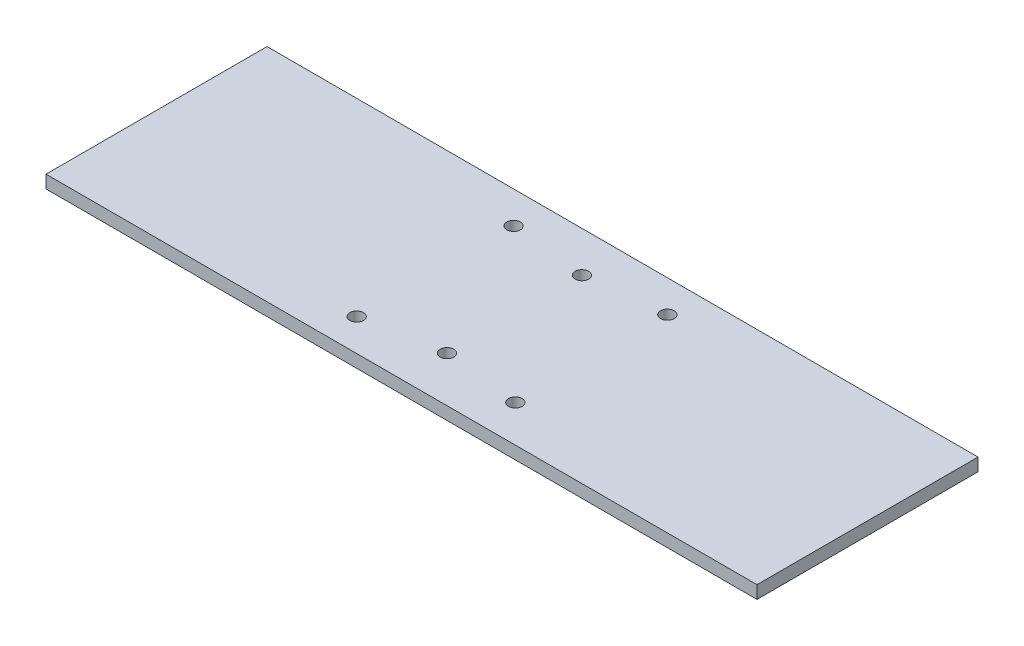
ISO-10303-21;
HEADER;
FILE_DESCRIPTION(('STEP AP214'),'2;1');
FILE_NAME('part.step','',(''),(''),'','','');
FILE_SCHEMA(('AUTOMOTIVE_DESIGN { 1 0 10303 214 1 1 1 1 }'));
ENDSEC;
DATA;
#1=APPLICATION_CONTEXT('core data for automotive mechanical design processes');
#2=APPLICATION_PROTOCOL_DEFINITION('international standard','automotive_design',2000,#1);
#3=PRODUCT_CONTEXT('',#1,'mechanical');
#4=PRODUCT('Part','Part','',(#3));
#5=PRODUCT_RELATED_PRODUCT_CATEGORY('part','',(#4));
#6=PRODUCT_DEFINITION_FORMATION('','',#4);
#7=PRODUCT_DEFINITION_CONTEXT('part definition',#1,'design');
#8=PRODUCT_DEFINITION('design','',#6,#7);
#9=PRODUCT_DEFINITION_SHAPE('','',#8);
#10=(LENGTH_UNIT() NAMED_UNIT(*) SI_UNIT(.MILLI.,.METRE.));
#11=(NAMED_UNIT(*) PLANE_ANGLE_UNIT() SI_UNIT($,.RADIAN.));
#12=(NAMED_UNIT(*) SI_UNIT($,.STERADIAN.) SOLID_ANGLE_UNIT());
#13=UNCERTAINTY_MEASURE_WITH_UNIT(LENGTH_MEASURE(1.E-05),#10,'distance_accuracy_value','');
#14=(GEOMETRIC_REPRESENTATION_CONTEXT(3) GLOBAL_UNCERTAINTY_ASSIGNED_CONTEXT((#13)) GLOBAL_UNIT_ASSIGNED_CONTEXT((#10,
#11,#12)) REPRESENTATION_CONTEXT('',''));
#15=CARTESIAN_POINT('',(0.,0.,0.));
#16=DIRECTION('',(0.,0.,1.));
#17=DIRECTION('',(1.,0.,0.));
#18=AXIS2_PLACEMENT_3D('',#15,#16,#17);
#19=CARTESIAN_POINT('',(-83.24,3.,-51.75));
#20=DIRECTION('',(1.,0.,0.));
#21=DIRECTION('',(0.,0.,-1.));
#22=AXIS2_PLACEMENT_3D('',#19,#20,#21);
#23=PLANE('',#22);
#24=DIRECTION('',(0.,0.,1.));
#25=VECTOR('',#24,1.);
#26=CARTESIAN_POINT('',(-83.24,0.,-51.75));
#27=LINE('',#26,#25);
#28=CARTESIAN_POINT('',(-83.24,0.,-51.75));
#29=VERTEX_POINT('',#28);
#30=CARTESIAN_POINT('',(-83.24,0.,0.));
#31=VERTEX_POINT('',#30);
#32=EDGE_CURVE('E105',#29,#31,#27,.T.);
#33=ORIENTED_EDGE('',*,*,#32,.T.);
#34=DIRECTION('',(0.,-1.,0.));
#35=VECTOR('',#34,1.);
#36=CARTESIAN_POINT('',(-83.24,3.,0.));
#37=LINE('',#36,#35);
#38=CARTESIAN_POINT('',(-83.24,3.,0.));
#39=VERTEX_POINT('',#38);
#40=EDGE_CURVE('E11',#39,#31,#37,.T.);
#41=ORIENTED_EDGE('',*,*,#40,.F.);
#42=DIRECTION('',(0.,0.,1.));
#43=VECTOR('',#42,1.);
#44=CARTESIAN_POINT('',(-83.24,3.,-51.75));
#45=LINE('',#44,#43);
#46=CARTESIAN_POINT('',(-83.24,3.,-51.75));
#47=VERTEX_POINT('',#46);
#48=EDGE_CURVE('E92',#47,#39,#45,.T.);
#49=ORIENTED_EDGE('',*,*,#48,.F.);
#50=DIRECTION('',(0.,-1.,0.));
#51=VECTOR('',#50,1.);
#52=CARTESIAN_POINT('',(-83.24,3.,-51.75));
#53=LINE('',#52,#51);
#54=EDGE_CURVE('E101',#47,#29,#53,.T.);
#55=ORIENTED_EDGE('',*,*,#54,.T.);
#56=EDGE_LOOP('',(#33,#41,#49,#55));
#57=FACE_BOUND('',#56,.T.);
#58=ADVANCED_FACE('F39',(#57),#23,.F.);
#59=CARTESIAN_POINT('',(-83.24,3.,0.));
#60=DIRECTION('',(0.,0.,-1.));
#61=DIRECTION('',(-1.,0.,0.));
#62=AXIS2_PLACEMENT_3D('',#59,#60,#61);
#63=PLANE('',#62);
#64=DIRECTION('',(1.,0.,0.));
#65=VECTOR('',#64,1.);
#66=CARTESIAN_POINT('',(-83.24,0.,0.));
#67=LINE('',#66,#65);
#68=CARTESIAN_POINT('',(83.24,0.,0.));
#69=VERTEX_POINT('',#68);
#70=EDGE_CURVE('E96',#31,#69,#67,.T.);
#71=ORIENTED_EDGE('',*,*,#70,.T.);
#72=DIRECTION('',(0.,-1.,0.));
#73=VECTOR('',#72,1.);
#74=CARTESIAN_POINT('',(83.24,3.,0.));
#75=LINE('',#74,#73);
#76=CARTESIAN_POINT('',(83.24,3.,0.));
#77=VERTEX_POINT('',#76);
#78=EDGE_CURVE('E48',#77,#69,#75,.T.);
#79=ORIENTED_EDGE('',*,*,#78,.F.);
#80=DIRECTION('',(1.,0.,0.));
#81=VECTOR('',#80,1.);
#82=CARTESIAN_POINT('',(-83.24,3.,0.));
#83=LINE('',#82,#81);
#84=EDGE_CURVE('E87',#39,#77,#83,.T.);
#85=ORIENTED_EDGE('',*,*,#84,.F.);
#86=ORIENTED_EDGE('',*,*,#40,.T.);
#87=EDGE_LOOP('',(#71,#79,#85,#86));
#88=FACE_BOUND('',#87,.T.);
#89=ADVANCED_FACE('F95',(#88),#63,.F.);
#90=CARTESIAN_POINT('',(83.24,3.,-51.75));
#91=DIRECTION('',(-1.,0.,0.));
#92=DIRECTION('',(0.,0.,1.));
#93=AXIS2_PLACEMENT_3D('',#90,#91,#92);
#94=PLANE('',#93);
#95=DIRECTION('',(0.,0.,-1.));
#96=VECTOR('',#95,1.);
#97=CARTESIAN_POINT('',(83.24,0.,-51.75));
#98=LINE('',#97,#96);
#99=CARTESIAN_POINT('',(83.24,0.,-51.75));
#100=VERTEX_POINT('',#99);
#101=EDGE_CURVE('E74',#69,#100,#98,.T.);
#102=ORIENTED_EDGE('',*,*,#101,.T.);
#103=DIRECTION('',(0.,-1.,0.));
#104=VECTOR('',#103,1.);
#105=CARTESIAN_POINT('',(83.24,3.,-51.75));
#106=LINE('',#105,#104);
#107=CARTESIAN_POINT('',(83.24,3.,-51.75));
#108=VERTEX_POINT('',#107);
#109=EDGE_CURVE('E97',#108,#100,#106,.T.);
#110=ORIENTED_EDGE('',*,*,#109,.F.);
#111=DIRECTION('',(0.,0.,-1.));
#112=VECTOR('',#111,1.);
#113=CARTESIAN_POINT('',(83.24,3.,-51.75));
#114=LINE('',#113,#112);
#115=EDGE_CURVE('E90',#77,#108,#114,.T.);
#116=ORIENTED_EDGE('',*,*,#115,.F.);
#117=ORIENTED_EDGE('',*,*,#78,.T.);
#118=EDGE_LOOP('',(#102,#110,#116,#117));
#119=FACE_BOUND('',#118,.T.);
#120=ADVANCED_FACE('F99',(#119),#94,.F.);
#121=CARTESIAN_POINT('',(-83.24,3.,-51.75));
#122=DIRECTION('',(0.,0.,1.));
#123=DIRECTION('',(1.,0.,0.));
#124=AXIS2_PLACEMENT_3D('',#121,#122,#123);
#125=PLANE('',#124);
#126=DIRECTION('',(-1.,0.,0.));
#127=VECTOR('',#126,1.);
#128=CARTESIAN_POINT('',(-83.24,0.,-51.75));
#129=LINE('',#128,#127);
#130=EDGE_CURVE('E80',#100,#29,#129,.T.);
#131=ORIENTED_EDGE('',*,*,#130,.T.);
#132=ORIENTED_EDGE('',*,*,#54,.F.);
#133=DIRECTION('',(-1.,0.,0.));
#134=VECTOR('',#133,1.);
#135=CARTESIAN_POINT('',(-83.24,3.,-51.75));
#136=LINE('',#135,#134);
#137=EDGE_CURVE('E57',#108,#47,#136,.T.);
#138=ORIENTED_EDGE('',*,*,#137,.F.);
#139=ORIENTED_EDGE('',*,*,#109,.T.);
#140=EDGE_LOOP('',(#131,#132,#138,#139));
#141=FACE_BOUND('',#140,.T.);
#142=ADVANCED_FACE('F151',(#141),#125,.F.);
#143=CARTESIAN_POINT('',(0.,3.,0.));
#144=DIRECTION('',(0.,1.,0.));
#145=DIRECTION('',(0.,0.,1.));
#146=AXIS2_PLACEMENT_3D('',#143,#144,#145);
#147=PLANE('',#146);
#148=CARTESIAN_POINT('',(-18.,3.,-7.5));
#149=DIRECTION('',(0.,1.,0.));
#150=DIRECTION('',(0.,0.,1.));
#151=AXIS2_PLACEMENT_3D('',#148,#149,#150);
#152=CIRCLE('',#151,1.6);
#153=CARTESIAN_POINT('',(-18.,3.,-5.9));
#154=VERTEX_POINT('',#153);
#155=EDGE_CURVE('E286',#154,#154,#152,.T.);
#156=ORIENTED_EDGE('',*,*,#155,.F.);
#157=EDGE_LOOP('',(#156));
#158=FACE_BOUND('',#157,.T.);
#159=CARTESIAN_POINT('',(18.,3.,-8.65378948989618));
#160=DIRECTION('',(0.,1.,0.));
#161=DIRECTION('',(0.,0.,1.));
#162=AXIS2_PLACEMENT_3D('',#159,#160,#161);
#163=CIRCLE('',#162,1.6);
#164=CARTESIAN_POINT('',(18.,3.,-7.05378948989618));
#165=VERTEX_POINT('',#164);
#166=EDGE_CURVE('E287',#165,#165,#163,.T.);
#167=ORIENTED_EDGE('',*,*,#166,.F.);
#168=EDGE_LOOP('',(#167));
#169=FACE_BOUND('',#168,.T.);
#170=CARTESIAN_POINT('',(0.,3.,-10.6537894898962));
#171=DIRECTION('',(0.,1.,0.));
#172=DIRECTION('',(0.,0.,1.));
#173=AXIS2_PLACEMENT_3D('',#170,#171,#172);
#174=CIRCLE('',#173,1.6);
#175=CARTESIAN_POINT('',(0.,3.,-9.05378948989618));
#176=VERTEX_POINT('',#175);
#177=EDGE_CURVE('E126',#176,#176,#174,.T.);
#178=ORIENTED_EDGE('',*,*,#177,.F.);
#179=EDGE_LOOP('',(#178));
#180=FACE_BOUND('',#179,.T.);
#181=CARTESIAN_POINT('',(-18.,3.,-44.25));
#182=DIRECTION('',(0.,1.,0.));
#183=DIRECTION('',(0.,0.,1.));
#184=AXIS2_PLACEMENT_3D('',#181,#182,#183);
#185=CIRCLE('',#184,1.6);
#186=CARTESIAN_POINT('',(-18.,3.,-42.65));
#187=VERTEX_POINT('',#186);
#188=EDGE_CURVE('E131',#187,#187,#185,.T.);
#189=ORIENTED_EDGE('',*,*,#188,.F.);
#190=EDGE_LOOP('',(#189));
#191=FACE_BOUND('',#190,.T.);
#192=CARTESIAN_POINT('',(18.,3.,-44.25));
#193=DIRECTION('',(0.,1.,0.));
#194=DIRECTION('',(0.,0.,1.));
#195=AXIS2_PLACEMENT_3D('',#192,#193,#194);
#196=CIRCLE('',#195,1.6);
#197=CARTESIAN_POINT('',(18.,3.,-42.65));
#198=VERTEX_POINT('',#197);
#199=EDGE_CURVE('E135',#198,#198,#196,.T.);
#200=ORIENTED_EDGE('',*,*,#199,.F.);
#201=EDGE_LOOP('',(#200));
#202=FACE_BOUND('',#201,.T.);
#203=CARTESIAN_POINT('',(0.,3.,-42.25));
#204=DIRECTION('',(0.,1.,0.));
#205=DIRECTION('',(0.,0.,1.));
#206=AXIS2_PLACEMENT_3D('',#203,#204,#205);
#207=CIRCLE('',#206,1.6);
#208=CARTESIAN_POINT('',(0.,3.,-40.65));
#209=VERTEX_POINT('',#208);
#210=EDGE_CURVE('E118',#209,#209,#207,.T.);
#211=ORIENTED_EDGE('',*,*,#210,.F.);
#212=EDGE_LOOP('',(#211));
#213=FACE_BOUND('',#212,.T.);
#214=ORIENTED_EDGE('',*,*,#48,.T.);
#215=ORIENTED_EDGE('',*,*,#84,.T.);
#216=ORIENTED_EDGE('',*,*,#115,.T.);
#217=ORIENTED_EDGE('',*,*,#137,.T.);
#218=EDGE_LOOP('',(#214,#215,#216,#217));
#219=FACE_BOUND('',#218,.T.);
#220=ADVANCED_FACE('F88',(#158,#169,#180,#191,#202,#213,#219),#147,.T.);
#221=CARTESIAN_POINT('',(0.,0.,0.));
#222=DIRECTION('',(0.,1.,0.));
#223=DIRECTION('',(0.,0.,1.));
#224=AXIS2_PLACEMENT_3D('',#221,#222,#223);
#225=PLANE('',#224);
#226=CARTESIAN_POINT('',(-18.,0.,-7.5));
#227=DIRECTION('',(0.,1.,0.));
#228=DIRECTION('',(0.,0.,1.));
#229=AXIS2_PLACEMENT_3D('',#226,#227,#228);
#230=CIRCLE('',#229,1.6);
#231=CARTESIAN_POINT('',(-18.,0.,-5.9));
#232=VERTEX_POINT('',#231);
#233=EDGE_CURVE('E42',#232,#232,#230,.T.);
#234=ORIENTED_EDGE('',*,*,#233,.T.);
#235=EDGE_LOOP('',(#234));
#236=FACE_BOUND('',#235,.T.);
#237=CARTESIAN_POINT('',(18.,0.,-8.65378948989618));
#238=DIRECTION('',(0.,1.,0.));
#239=DIRECTION('',(0.,0.,1.));
#240=AXIS2_PLACEMENT_3D('',#237,#238,#239);
#241=CIRCLE('',#240,1.6);
#242=CARTESIAN_POINT('',(18.,0.,-7.05378948989618));
#243=VERTEX_POINT('',#242);
#244=EDGE_CURVE('E125',#243,#243,#241,.T.);
#245=ORIENTED_EDGE('',*,*,#244,.T.);
#246=EDGE_LOOP('',(#245));
#247=FACE_BOUND('',#246,.T.);
#248=CARTESIAN_POINT('',(0.,0.,-10.6537894898962));
#249=DIRECTION('',(0.,1.,0.));
#250=DIRECTION('',(0.,0.,1.));
#251=AXIS2_PLACEMENT_3D('',#248,#249,#250);
#252=CIRCLE('',#251,1.6);
#253=CARTESIAN_POINT('',(0.,0.,-9.05378948989618));
#254=VERTEX_POINT('',#253);
#255=EDGE_CURVE('E123',#254,#254,#252,.T.);
#256=ORIENTED_EDGE('',*,*,#255,.T.);
#257=EDGE_LOOP('',(#256));
#258=FACE_BOUND('',#257,.T.);
#259=CARTESIAN_POINT('',(-18.,0.,-44.25));
#260=DIRECTION('',(0.,1.,0.));
#261=DIRECTION('',(0.,0.,1.));
#262=AXIS2_PLACEMENT_3D('',#259,#260,#261);
#263=CIRCLE('',#262,1.6);
#264=CARTESIAN_POINT('',(-18.,0.,-42.65));
#265=VERTEX_POINT('',#264);
#266=EDGE_CURVE('E108',#265,#265,#263,.T.);
#267=ORIENTED_EDGE('',*,*,#266,.T.);
#268=EDGE_LOOP('',(#267));
#269=FACE_BOUND('',#268,.T.);
#270=CARTESIAN_POINT('',(18.,0.,-44.25));
#271=DIRECTION('',(0.,1.,0.));
#272=DIRECTION('',(0.,0.,1.));
#273=AXIS2_PLACEMENT_3D('',#270,#271,#272);
#274=CIRCLE('',#273,1.6);
#275=CARTESIAN_POINT('',(18.,0.,-42.65));
#276=VERTEX_POINT('',#275);
#277=EDGE_CURVE('E117',#276,#276,#274,.T.);
#278=ORIENTED_EDGE('',*,*,#277,.T.);
#279=EDGE_LOOP('',(#278));
#280=FACE_BOUND('',#279,.T.);
#281=CARTESIAN_POINT('',(0.,0.,-42.25));
#282=DIRECTION('',(0.,1.,0.));
#283=DIRECTION('',(0.,0.,1.));
#284=AXIS2_PLACEMENT_3D('',#281,#282,#283);
#285=CIRCLE('',#284,1.6);
#286=CARTESIAN_POINT('',(0.,0.,-40.65));
#287=VERTEX_POINT('',#286);
#288=EDGE_CURVE('E114',#287,#287,#285,.T.);
#289=ORIENTED_EDGE('',*,*,#288,.T.);
#290=EDGE_LOOP('',(#289));
#291=FACE_BOUND('',#290,.T.);
#292=ORIENTED_EDGE('',*,*,#32,.F.);
#293=ORIENTED_EDGE('',*,*,#130,.F.);
#294=ORIENTED_EDGE('',*,*,#101,.F.);
#295=ORIENTED_EDGE('',*,*,#70,.F.);
#296=EDGE_LOOP('',(#292,#293,#294,#295));
#297=FACE_BOUND('',#296,.T.);
#298=ADVANCED_FACE('F150',(#236,#247,#258,#269,#280,#291,#297),#225,.F.);
#299=CARTESIAN_POINT('',(0.,-7.,-42.25));
#300=DIRECTION('',(0.,1.,0.));
#301=DIRECTION('',(0.,0.,1.));
#302=AXIS2_PLACEMENT_3D('',#299,#300,#301);
#303=CYLINDRICAL_SURFACE('',#302,1.6);
#304=ORIENTED_EDGE('',*,*,#210,.T.);
#305=EDGE_LOOP('',(#304));
#306=FACE_BOUND('',#305,.T.);
#307=ORIENTED_EDGE('',*,*,#288,.F.);
#308=EDGE_LOOP('',(#307));
#309=FACE_BOUND('',#308,.T.);
#310=ADVANCED_FACE('F146',(#306,#309),#303,.F.);
#311=CARTESIAN_POINT('',(18.,-7.,-44.25));
#312=DIRECTION('',(0.,1.,0.));
#313=DIRECTION('',(0.,0.,1.));
#314=AXIS2_PLACEMENT_3D('',#311,#312,#313);
#315=CYLINDRICAL_SURFACE('',#314,1.6);
#316=ORIENTED_EDGE('',*,*,#199,.T.);
#317=EDGE_LOOP('',(#316));
#318=FACE_BOUND('',#317,.T.);
#319=ORIENTED_EDGE('',*,*,#277,.F.);
#320=EDGE_LOOP('',(#319));
#321=FACE_BOUND('',#320,.T.);
#322=ADVANCED_FACE('F191',(#318,#321),#315,.F.);
#323=CARTESIAN_POINT('',(-18.,-7.,-44.25));
#324=DIRECTION('',(0.,1.,0.));
#325=DIRECTION('',(0.,0.,1.));
#326=AXIS2_PLACEMENT_3D('',#323,#324,#325);
#327=CYLINDRICAL_SURFACE('',#326,1.6);
#328=ORIENTED_EDGE('',*,*,#188,.T.);
#329=EDGE_LOOP('',(#328));
#330=FACE_BOUND('',#329,.T.);
#331=ORIENTED_EDGE('',*,*,#266,.F.);
#332=EDGE_LOOP('',(#331));
#333=FACE_BOUND('',#332,.T.);
#334=ADVANCED_FACE('F201',(#330,#333),#327,.F.);
#335=CARTESIAN_POINT('',(0.,-7.,-10.6537894898962));
#336=DIRECTION('',(0.,1.,0.));
#337=DIRECTION('',(0.,0.,1.));
#338=AXIS2_PLACEMENT_3D('',#335,#336,#337);
#339=CYLINDRICAL_SURFACE('',#338,1.6);
#340=ORIENTED_EDGE('',*,*,#177,.T.);
#341=EDGE_LOOP('',(#340));
#342=FACE_BOUND('',#341,.T.);
#343=ORIENTED_EDGE('',*,*,#255,.F.);
#344=EDGE_LOOP('',(#343));
#345=FACE_BOUND('',#344,.T.);
#346=ADVANCED_FACE('F211',(#342,#345),#339,.F.);
#347=CARTESIAN_POINT('',(18.,-7.,-8.65378948989618));
#348=DIRECTION('',(0.,1.,0.));
#349=DIRECTION('',(0.,0.,1.));
#350=AXIS2_PLACEMENT_3D('',#347,#348,#349);
#351=CYLINDRICAL_SURFACE('',#350,1.6);
#352=ORIENTED_EDGE('',*,*,#166,.T.);
#353=EDGE_LOOP('',(#352));
#354=FACE_BOUND('',#353,.T.);
#355=ORIENTED_EDGE('',*,*,#244,.F.);
#356=EDGE_LOOP('',(#355));
#357=FACE_BOUND('',#356,.T.);
#358=ADVANCED_FACE('F232',(#354,#357),#351,.F.);
#359=CARTESIAN_POINT('',(-18.,-7.,-7.5));
#360=DIRECTION('',(0.,1.,0.));
#361=DIRECTION('',(0.,0.,1.));
#362=AXIS2_PLACEMENT_3D('',#359,#360,#361);
#363=CYLINDRICAL_SURFACE('',#362,1.6);
#364=ORIENTED_EDGE('',*,*,#155,.T.);
#365=EDGE_LOOP('',(#364));
#366=FACE_BOUND('',#365,.T.);
#367=ORIENTED_EDGE('',*,*,#233,.F.);
#368=EDGE_LOOP('',(#367));
#369=FACE_BOUND('',#368,.T.);
#370=ADVANCED_FACE('F243',(#366,#369),#363,.F.);
#371=CLOSED_SHELL('',(#58,#89,#120,#142,#220,#298,#310,#322,#334,#346,#358,#370));
#372=MANIFOLD_SOLID_BREP('B2',#371);
#373=ADVANCED_BREP_SHAPE_REPRESENTATION('',(#18,#372),#14);
#374=SHAPE_DEFINITION_REPRESENTATION(#9,#373);
ENDSEC;
END-ISO-10303-21;
